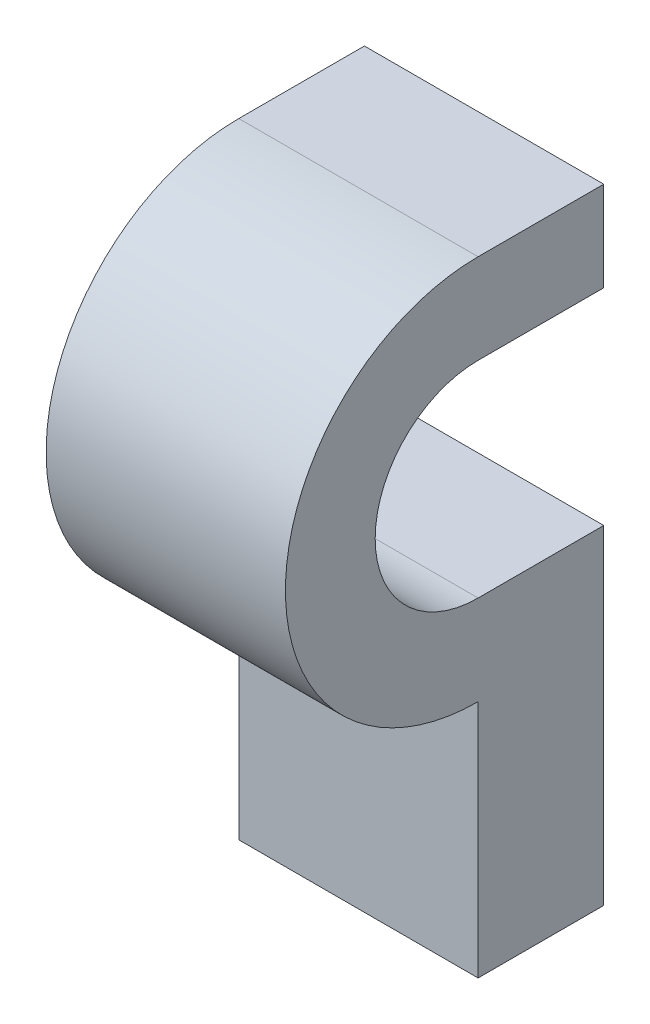
ISO-10303-21;
HEADER;
FILE_DESCRIPTION(('STEP AP214'),'2;1');
FILE_NAME('part.step','',(''),(''),'','','');
FILE_SCHEMA(('AUTOMOTIVE_DESIGN { 1 0 10303 214 1 1 1 1 }'));
ENDSEC;
DATA;
#1=APPLICATION_CONTEXT('core data for automotive mechanical design processes');
#2=APPLICATION_PROTOCOL_DEFINITION('international standard','automotive_design',2000,#1);
#3=PRODUCT_CONTEXT('',#1,'mechanical');
#4=PRODUCT('Part','Part','',(#3));
#5=PRODUCT_RELATED_PRODUCT_CATEGORY('part','',(#4));
#6=PRODUCT_DEFINITION_FORMATION('','',#4);
#7=PRODUCT_DEFINITION_CONTEXT('part definition',#1,'design');
#8=PRODUCT_DEFINITION('design','',#6,#7);
#9=PRODUCT_DEFINITION_SHAPE('','',#8);
#10=(LENGTH_UNIT() NAMED_UNIT(*) SI_UNIT(.MILLI.,.METRE.));
#11=(NAMED_UNIT(*) PLANE_ANGLE_UNIT() SI_UNIT($,.RADIAN.));
#12=(NAMED_UNIT(*) SI_UNIT($,.STERADIAN.) SOLID_ANGLE_UNIT());
#13=UNCERTAINTY_MEASURE_WITH_UNIT(LENGTH_MEASURE(1.E-05),#10,'distance_accuracy_value','');
#14=(GEOMETRIC_REPRESENTATION_CONTEXT(3) GLOBAL_UNCERTAINTY_ASSIGNED_CONTEXT((#13)) GLOBAL_UNIT_ASSIGNED_CONTEXT((#10,
#11,#12)) REPRESENTATION_CONTEXT('',''));
#15=CARTESIAN_POINT('',(0.,0.,0.));
#16=DIRECTION('',(0.,0.,1.));
#17=DIRECTION('',(1.,0.,0.));
#18=AXIS2_PLACEMENT_3D('',#15,#16,#17);
#19=CARTESIAN_POINT('',(8.,4.82104996137775,4.2));
#20=DIRECTION('',(-1.,0.,0.));
#21=DIRECTION('',(0.,0.,1.));
#22=AXIS2_PLACEMENT_3D('',#19,#20,#21);
#23=CYLINDRICAL_SURFACE('',#22,6.44);
#24=CARTESIAN_POINT('',(0.,4.82104996137775,4.2));
#25=DIRECTION('',(1.,0.,0.));
#26=DIRECTION('',(0.,0.,1.));
#27=AXIS2_PLACEMENT_3D('',#24,#25,#26);
#28=CIRCLE('',#27,6.44);
#29=CARTESIAN_POINT('',(0.,11.2610499613777,4.2));
#30=VERTEX_POINT('',#29);
#31=CARTESIAN_POINT('',(0.,-1.61895003862225,4.2));
#32=VERTEX_POINT('',#31);
#33=EDGE_CURVE('E141',#30,#32,#28,.T.);
#34=ORIENTED_EDGE('',*,*,#33,.T.);
#35=DIRECTION('',(-1.,0.,0.));
#36=VECTOR('',#35,1.);
#37=CARTESIAN_POINT('',(8.,-1.61895003862225,4.2));
#38=LINE('',#37,#36);
#39=CARTESIAN_POINT('',(8.,-1.61895003862225,4.2));
#40=VERTEX_POINT('',#39);
#41=EDGE_CURVE('E11',#40,#32,#38,.T.);
#42=ORIENTED_EDGE('',*,*,#41,.F.);
#43=CARTESIAN_POINT('',(8.,4.82104996137775,4.2));
#44=DIRECTION('',(1.,0.,0.));
#45=DIRECTION('',(0.,0.,1.));
#46=AXIS2_PLACEMENT_3D('',#43,#44,#45);
#47=CIRCLE('',#46,6.44);
#48=CARTESIAN_POINT('',(8.,11.2610499613777,4.2));
#49=VERTEX_POINT('',#48);
#50=EDGE_CURVE('E158',#49,#40,#47,.T.);
#51=ORIENTED_EDGE('',*,*,#50,.F.);
#52=DIRECTION('',(-1.,0.,0.));
#53=VECTOR('',#52,1.);
#54=CARTESIAN_POINT('',(8.,11.2610499613777,4.2));
#55=LINE('',#54,#53);
#56=EDGE_CURVE('E137',#49,#30,#55,.T.);
#57=ORIENTED_EDGE('',*,*,#56,.T.);
#58=EDGE_LOOP('',(#34,#42,#51,#57));
#59=FACE_BOUND('',#58,.T.);
#60=ADVANCED_FACE('F39',(#59),#23,.T.);
#61=CARTESIAN_POINT('',(8.,-9.61895003862225,4.2));
#62=DIRECTION('',(0.,0.,-1.));
#63=DIRECTION('',(0.,1.,0.));
#64=AXIS2_PLACEMENT_3D('',#61,#62,#63);
#65=PLANE('',#64);
#66=DIRECTION('',(0.,-1.,0.));
#67=VECTOR('',#66,1.);
#68=CARTESIAN_POINT('',(0.,-9.61895003862225,4.2));
#69=LINE('',#68,#67);
#70=CARTESIAN_POINT('',(0.,-9.61895003862225,4.2));
#71=VERTEX_POINT('',#70);
#72=EDGE_CURVE('E144',#32,#71,#69,.T.);
#73=ORIENTED_EDGE('',*,*,#72,.T.);
#74=DIRECTION('',(-1.,0.,0.));
#75=VECTOR('',#74,1.);
#76=CARTESIAN_POINT('',(8.,-9.61895003862225,4.2));
#77=LINE('',#76,#75);
#78=CARTESIAN_POINT('',(8.,-9.61895003862225,4.2));
#79=VERTEX_POINT('',#78);
#80=EDGE_CURVE('E47',#79,#71,#77,.T.);
#81=ORIENTED_EDGE('',*,*,#80,.F.);
#82=DIRECTION('',(0.,-1.,0.));
#83=VECTOR('',#82,1.);
#84=CARTESIAN_POINT('',(8.,-9.61895003862225,4.2));
#85=LINE('',#84,#83);
#86=EDGE_CURVE('E101',#40,#79,#85,.T.);
#87=ORIENTED_EDGE('',*,*,#86,.F.);
#88=ORIENTED_EDGE('',*,*,#41,.T.);
#89=EDGE_LOOP('',(#73,#81,#87,#88));
#90=FACE_BOUND('',#89,.T.);
#91=ADVANCED_FACE('F222',(#90),#65,.F.);
#92=CARTESIAN_POINT('',(8.,-9.61895003862225,0.));
#93=DIRECTION('',(0.,1.,0.));
#94=DIRECTION('',(0.,0.,1.));
#95=AXIS2_PLACEMENT_3D('',#92,#93,#94);
#96=PLANE('',#95);
#97=DIRECTION('',(0.,0.,-1.));
#98=VECTOR('',#97,1.);
#99=CARTESIAN_POINT('',(0.,-9.61895003862225,0.));
#100=LINE('',#99,#98);
#101=CARTESIAN_POINT('',(0.,-9.61895003862225,0.));
#102=VERTEX_POINT('',#101);
#103=EDGE_CURVE('E147',#71,#102,#100,.T.);
#104=ORIENTED_EDGE('',*,*,#103,.T.);
#105=DIRECTION('',(-1.,0.,0.));
#106=VECTOR('',#105,1.);
#107=CARTESIAN_POINT('',(8.,-9.61895003862225,0.));
#108=LINE('',#107,#106);
#109=CARTESIAN_POINT('',(8.,-9.61895003862225,0.));
#110=VERTEX_POINT('',#109);
#111=EDGE_CURVE('E168',#110,#102,#108,.T.);
#112=ORIENTED_EDGE('',*,*,#111,.F.);
#113=DIRECTION('',(0.,0.,-1.));
#114=VECTOR('',#113,1.);
#115=CARTESIAN_POINT('',(8.,-9.61895003862225,0.));
#116=LINE('',#115,#114);
#117=EDGE_CURVE('E176',#79,#110,#116,.T.);
#118=ORIENTED_EDGE('',*,*,#117,.F.);
#119=ORIENTED_EDGE('',*,*,#80,.T.);
#120=EDGE_LOOP('',(#104,#112,#118,#119));
#121=FACE_BOUND('',#120,.T.);
#122=ADVANCED_FACE('F174',(#121),#96,.F.);
#123=CARTESIAN_POINT('',(8.,1.38104996137775,0.));
#124=DIRECTION('',(0.,0.,1.));
#125=DIRECTION('',(0.,-1.,0.));
#126=AXIS2_PLACEMENT_3D('',#123,#124,#125);
#127=PLANE('',#126);
#128=CARTESIAN_POINT('',(4.,-5.61895003862225,0.));
#129=DIRECTION('',(0.,0.,-1.));
#130=DIRECTION('',(0.,1.,0.));
#131=AXIS2_PLACEMENT_3D('',#128,#129,#130);
#132=CIRCLE('',#131,2.);
#133=CARTESIAN_POINT('',(4.,-3.61895003862225,0.));
#134=VERTEX_POINT('',#133);
#135=EDGE_CURVE('E199',#134,#134,#132,.T.);
#136=ORIENTED_EDGE('',*,*,#135,.F.);
#137=EDGE_LOOP('',(#136));
#138=FACE_BOUND('',#137,.T.);
#139=DIRECTION('',(0.,1.,0.));
#140=VECTOR('',#139,1.);
#141=CARTESIAN_POINT('',(0.,1.38104996137775,0.));
#142=LINE('',#141,#140);
#143=CARTESIAN_POINT('',(0.,1.38104996137775,0.));
#144=VERTEX_POINT('',#143);
#145=EDGE_CURVE('E149',#102,#144,#142,.T.);
#146=ORIENTED_EDGE('',*,*,#145,.T.);
#147=DIRECTION('',(-1.,0.,0.));
#148=VECTOR('',#147,1.);
#149=CARTESIAN_POINT('',(8.,1.38104996137775,0.));
#150=LINE('',#149,#148);
#151=CARTESIAN_POINT('',(8.,1.38104996137775,0.));
#152=VERTEX_POINT('',#151);
#153=EDGE_CURVE('E165',#152,#144,#150,.T.);
#154=ORIENTED_EDGE('',*,*,#153,.F.);
#155=DIRECTION('',(0.,1.,0.));
#156=VECTOR('',#155,1.);
#157=CARTESIAN_POINT('',(8.,1.38104996137775,0.));
#158=LINE('',#157,#156);
#159=EDGE_CURVE('E192',#110,#152,#158,.T.);
#160=ORIENTED_EDGE('',*,*,#159,.F.);
#161=ORIENTED_EDGE('',*,*,#111,.T.);
#162=EDGE_LOOP('',(#146,#154,#160,#161));
#163=FACE_BOUND('',#162,.T.);
#164=ADVANCED_FACE('F185',(#138,#163),#127,.F.);
#165=CARTESIAN_POINT('',(8.,1.38104996137775,0.));
#166=DIRECTION('',(0.,-1.,0.));
#167=DIRECTION('',(0.,0.,-1.));
#168=AXIS2_PLACEMENT_3D('',#165,#166,#167);
#169=PLANE('',#168);
#170=DIRECTION('',(0.,0.,1.));
#171=VECTOR('',#170,1.);
#172=CARTESIAN_POINT('',(0.,1.38104996137775,0.));
#173=LINE('',#172,#171);
#174=CARTESIAN_POINT('',(0.,1.38104996137775,4.2));
#175=VERTEX_POINT('',#174);
#176=EDGE_CURVE('E151',#144,#175,#173,.T.);
#177=ORIENTED_EDGE('',*,*,#176,.T.);
#178=DIRECTION('',(-1.,0.,0.));
#179=VECTOR('',#178,1.);
#180=CARTESIAN_POINT('',(8.,1.38104996137775,4.2));
#181=LINE('',#180,#179);
#182=CARTESIAN_POINT('',(8.,1.38104996137775,4.2));
#183=VERTEX_POINT('',#182);
#184=EDGE_CURVE('E162',#183,#175,#181,.T.);
#185=ORIENTED_EDGE('',*,*,#184,.F.);
#186=DIRECTION('',(0.,0.,1.));
#187=VECTOR('',#186,1.);
#188=CARTESIAN_POINT('',(8.,1.38104996137775,0.));
#189=LINE('',#188,#187);
#190=EDGE_CURVE('E191',#152,#183,#189,.T.);
#191=ORIENTED_EDGE('',*,*,#190,.F.);
#192=ORIENTED_EDGE('',*,*,#153,.T.);
#193=EDGE_LOOP('',(#177,#185,#191,#192));
#194=FACE_BOUND('',#193,.T.);
#195=ADVANCED_FACE('F189',(#194),#169,.F.);
#196=CARTESIAN_POINT('',(8.,4.82104996137775,4.2));
#197=DIRECTION('',(-1.,0.,0.));
#198=DIRECTION('',(0.,0.,1.));
#199=AXIS2_PLACEMENT_3D('',#196,#197,#198);
#200=CYLINDRICAL_SURFACE('',#199,3.44);
#201=CARTESIAN_POINT('',(0.,4.82104996137775,4.2));
#202=DIRECTION('',(-1.,0.,0.));
#203=DIRECTION('',(0.,0.,1.));
#204=AXIS2_PLACEMENT_3D('',#201,#202,#203);
#205=CIRCLE('',#204,3.44);
#206=CARTESIAN_POINT('',(0.,8.26104996137774,4.2));
#207=VERTEX_POINT('',#206);
#208=EDGE_CURVE('E153',#175,#207,#205,.T.);
#209=ORIENTED_EDGE('',*,*,#208,.T.);
#210=DIRECTION('',(-1.,0.,0.));
#211=VECTOR('',#210,1.);
#212=CARTESIAN_POINT('',(8.,8.26104996137774,4.2));
#213=LINE('',#212,#211);
#214=CARTESIAN_POINT('',(8.,8.26104996137774,4.2));
#215=VERTEX_POINT('',#214);
#216=EDGE_CURVE('E132',#215,#207,#213,.T.);
#217=ORIENTED_EDGE('',*,*,#216,.F.);
#218=CARTESIAN_POINT('',(8.,4.82104996137775,4.2));
#219=DIRECTION('',(-1.,0.,0.));
#220=DIRECTION('',(0.,0.,1.));
#221=AXIS2_PLACEMENT_3D('',#218,#219,#220);
#222=CIRCLE('',#221,3.44);
#223=EDGE_CURVE('E123',#183,#215,#222,.T.);
#224=ORIENTED_EDGE('',*,*,#223,.F.);
#225=ORIENTED_EDGE('',*,*,#184,.T.);
#226=EDGE_LOOP('',(#209,#217,#224,#225));
#227=FACE_BOUND('',#226,.T.);
#228=ADVANCED_FACE('F219',(#227),#200,.F.);
#229=CARTESIAN_POINT('',(8.,8.26104996137775,0.));
#230=DIRECTION('',(0.,1.,0.));
#231=DIRECTION('',(0.,0.,1.));
#232=AXIS2_PLACEMENT_3D('',#229,#230,#231);
#233=PLANE('',#232);
#234=DIRECTION('',(0.,0.,-1.));
#235=VECTOR('',#234,1.);
#236=CARTESIAN_POINT('',(0.,8.26104996137775,0.));
#237=LINE('',#236,#235);
#238=CARTESIAN_POINT('',(0.,8.26104996137775,0.));
#239=VERTEX_POINT('',#238);
#240=EDGE_CURVE('E131',#207,#239,#237,.T.);
#241=ORIENTED_EDGE('',*,*,#240,.T.);
#242=DIRECTION('',(-1.,0.,0.));
#243=VECTOR('',#242,1.);
#244=CARTESIAN_POINT('',(8.,8.26104996137775,0.));
#245=LINE('',#244,#243);
#246=CARTESIAN_POINT('',(8.,8.26104996137775,0.));
#247=VERTEX_POINT('',#246);
#248=EDGE_CURVE('E128',#247,#239,#245,.T.);
#249=ORIENTED_EDGE('',*,*,#248,.F.);
#250=DIRECTION('',(0.,0.,-1.));
#251=VECTOR('',#250,1.);
#252=CARTESIAN_POINT('',(8.,8.26104996137775,0.));
#253=LINE('',#252,#251);
#254=EDGE_CURVE('E117',#215,#247,#253,.T.);
#255=ORIENTED_EDGE('',*,*,#254,.F.);
#256=ORIENTED_EDGE('',*,*,#216,.T.);
#257=EDGE_LOOP('',(#241,#249,#255,#256));
#258=FACE_BOUND('',#257,.T.);
#259=ADVANCED_FACE('F129',(#258),#233,.F.);
#260=CARTESIAN_POINT('',(8.,8.26104996137775,0.));
#261=DIRECTION('',(0.,0.,1.));
#262=DIRECTION('',(1.,0.,0.));
#263=AXIS2_PLACEMENT_3D('',#260,#261,#262);
#264=PLANE('',#263);
#265=DIRECTION('',(0.,1.,0.));
#266=VECTOR('',#265,1.);
#267=CARTESIAN_POINT('',(0.,8.26104996137775,0.));
#268=LINE('',#267,#266);
#269=CARTESIAN_POINT('',(0.,11.2610499613777,0.));
#270=VERTEX_POINT('',#269);
#271=EDGE_CURVE('E87',#239,#270,#268,.T.);
#272=ORIENTED_EDGE('',*,*,#271,.T.);
#273=DIRECTION('',(-1.,0.,0.));
#274=VECTOR('',#273,1.);
#275=CARTESIAN_POINT('',(8.,11.2610499613777,0.));
#276=LINE('',#275,#274);
#277=CARTESIAN_POINT('',(8.,11.2610499613777,0.));
#278=VERTEX_POINT('',#277);
#279=EDGE_CURVE('E133',#278,#270,#276,.T.);
#280=ORIENTED_EDGE('',*,*,#279,.F.);
#281=DIRECTION('',(0.,1.,0.));
#282=VECTOR('',#281,1.);
#283=CARTESIAN_POINT('',(8.,8.26104996137775,0.));
#284=LINE('',#283,#282);
#285=EDGE_CURVE('E121',#247,#278,#284,.T.);
#286=ORIENTED_EDGE('',*,*,#285,.F.);
#287=ORIENTED_EDGE('',*,*,#248,.T.);
#288=EDGE_LOOP('',(#272,#280,#286,#287));
#289=FACE_BOUND('',#288,.T.);
#290=ADVANCED_FACE('F135',(#289),#264,.F.);
#291=CARTESIAN_POINT('',(8.,11.2610499613777,0.));
#292=DIRECTION('',(0.,-1.,0.));
#293=DIRECTION('',(0.,0.,-1.));
#294=AXIS2_PLACEMENT_3D('',#291,#292,#293);
#295=PLANE('',#294);
#296=DIRECTION('',(0.,0.,1.));
#297=VECTOR('',#296,1.);
#298=CARTESIAN_POINT('',(0.,11.2610499613777,0.));
#299=LINE('',#298,#297);
#300=EDGE_CURVE('E93',#270,#30,#299,.T.);
#301=ORIENTED_EDGE('',*,*,#300,.T.);
#302=ORIENTED_EDGE('',*,*,#56,.F.);
#303=DIRECTION('',(0.,0.,1.));
#304=VECTOR('',#303,1.);
#305=CARTESIAN_POINT('',(8.,11.2610499613777,0.));
#306=LINE('',#305,#304);
#307=EDGE_CURVE('E55',#278,#49,#306,.T.);
#308=ORIENTED_EDGE('',*,*,#307,.F.);
#309=ORIENTED_EDGE('',*,*,#279,.T.);
#310=EDGE_LOOP('',(#301,#302,#308,#309));
#311=FACE_BOUND('',#310,.T.);
#312=ADVANCED_FACE('F241',(#311),#295,.F.);
#313=CARTESIAN_POINT('',(8.,4.82104996137775,4.2));
#314=DIRECTION('',(-1.,0.,0.));
#315=DIRECTION('',(0.,0.,1.));
#316=AXIS2_PLACEMENT_3D('',#313,#314,#315);
#317=PLANE('',#316);
#318=ORIENTED_EDGE('',*,*,#50,.T.);
#319=ORIENTED_EDGE('',*,*,#86,.T.);
#320=ORIENTED_EDGE('',*,*,#117,.T.);
#321=ORIENTED_EDGE('',*,*,#159,.T.);
#322=ORIENTED_EDGE('',*,*,#190,.T.);
#323=ORIENTED_EDGE('',*,*,#223,.T.);
#324=ORIENTED_EDGE('',*,*,#254,.T.);
#325=ORIENTED_EDGE('',*,*,#285,.T.);
#326=ORIENTED_EDGE('',*,*,#307,.T.);
#327=EDGE_LOOP('',(#318,#319,#320,#321,#322,#323,#324,#325,#326));
#328=FACE_BOUND('',#327,.T.);
#329=ADVANCED_FACE('F119',(#328),#317,.F.);
#330=CARTESIAN_POINT('',(0.,4.82104996137775,4.2));
#331=DIRECTION('',(-1.,0.,0.));
#332=DIRECTION('',(0.,0.,1.));
#333=AXIS2_PLACEMENT_3D('',#330,#331,#332);
#334=PLANE('',#333);
#335=ORIENTED_EDGE('',*,*,#33,.F.);
#336=ORIENTED_EDGE('',*,*,#300,.F.);
#337=ORIENTED_EDGE('',*,*,#271,.F.);
#338=ORIENTED_EDGE('',*,*,#240,.F.);
#339=ORIENTED_EDGE('',*,*,#208,.F.);
#340=ORIENTED_EDGE('',*,*,#176,.F.);
#341=ORIENTED_EDGE('',*,*,#145,.F.);
#342=ORIENTED_EDGE('',*,*,#103,.F.);
#343=ORIENTED_EDGE('',*,*,#72,.F.);
#344=EDGE_LOOP('',(#335,#336,#337,#338,#339,#340,#341,#342,#343));
#345=FACE_BOUND('',#344,.T.);
#346=ADVANCED_FACE('F180',(#345),#334,.T.);
#347=CARTESIAN_POINT('',(4.,-5.61895003862225,4.1));
#348=DIRECTION('',(0.,0.,-1.));
#349=DIRECTION('',(0.,1.,0.));
#350=AXIS2_PLACEMENT_3D('',#347,#348,#349);
#351=CYLINDRICAL_SURFACE('',#350,2.);
#352=CARTESIAN_POINT('',(4.,-5.61895003862225,4.1));
#353=DIRECTION('',(0.,0.,-1.));
#354=DIRECTION('',(0.,1.,0.));
#355=AXIS2_PLACEMENT_3D('',#352,#353,#354);
#356=CIRCLE('',#355,2.);
#357=CARTESIAN_POINT('',(4.,-3.61895003862225,4.1));
#358=VERTEX_POINT('',#357);
#359=EDGE_CURVE('E145',#358,#358,#356,.T.);
#360=ORIENTED_EDGE('',*,*,#359,.F.);
#361=EDGE_LOOP('',(#360));
#362=FACE_BOUND('',#361,.T.);
#363=ORIENTED_EDGE('',*,*,#135,.T.);
#364=EDGE_LOOP('',(#363));
#365=FACE_BOUND('',#364,.T.);
#366=ADVANCED_FACE('F207',(#362,#365),#351,.F.);
#367=CARTESIAN_POINT('',(4.,-5.61895003862225,4.1));
#368=DIRECTION('',(0.,0.,-1.));
#369=DIRECTION('',(0.,1.,0.));
#370=AXIS2_PLACEMENT_3D('',#367,#368,#369);
#371=PLANE('',#370);
#372=ORIENTED_EDGE('',*,*,#359,.T.);
#373=EDGE_LOOP('',(#372));
#374=FACE_BOUND('',#373,.T.);
#375=ADVANCED_FACE('F205',(#374),#371,.T.);
#376=CLOSED_SHELL('',(#60,#91,#122,#164,#195,#228,#259,#290,#312,#329,#346,#366,#375));
#377=MANIFOLD_SOLID_BREP('B2',#376);
#378=ADVANCED_BREP_SHAPE_REPRESENTATION('',(#18,#377),#14);
#379=SHAPE_DEFINITION_REPRESENTATION(#9,#378);
ENDSEC;
END-ISO-10303-21;
